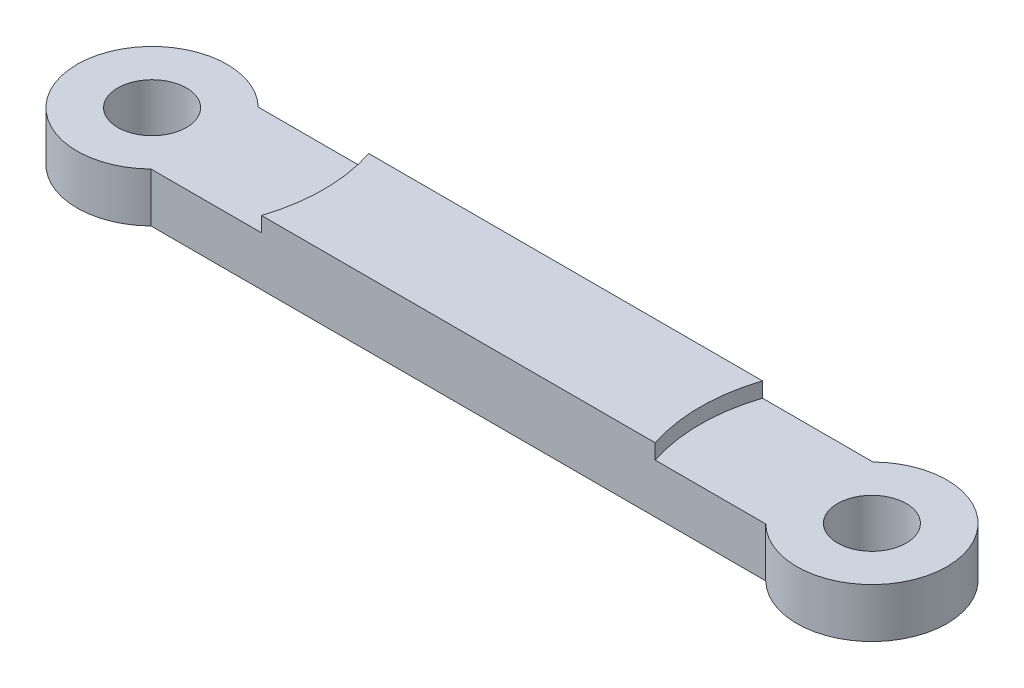
ISO-10303-21;
HEADER;
FILE_DESCRIPTION(('STEP AP214'),'2;1');
FILE_NAME('part.step','',(''),(''),'','','');
FILE_SCHEMA(('AUTOMOTIVE_DESIGN { 1 0 10303 214 1 1 1 1 }'));
ENDSEC;
DATA;
#1=APPLICATION_CONTEXT('core data for automotive mechanical design processes');
#2=APPLICATION_PROTOCOL_DEFINITION('international standard','automotive_design',2000,#1);
#3=PRODUCT_CONTEXT('',#1,'mechanical');
#4=PRODUCT('Part','Part','',(#3));
#5=PRODUCT_RELATED_PRODUCT_CATEGORY('part','',(#4));
#6=PRODUCT_DEFINITION_FORMATION('','',#4);
#7=PRODUCT_DEFINITION_CONTEXT('part definition',#1,'design');
#8=PRODUCT_DEFINITION('design','',#6,#7);
#9=PRODUCT_DEFINITION_SHAPE('','',#8);
#10=(LENGTH_UNIT() NAMED_UNIT(*) SI_UNIT(.MILLI.,.METRE.));
#11=(NAMED_UNIT(*) PLANE_ANGLE_UNIT() SI_UNIT($,.RADIAN.));
#12=(NAMED_UNIT(*) SI_UNIT($,.STERADIAN.) SOLID_ANGLE_UNIT());
#13=UNCERTAINTY_MEASURE_WITH_UNIT(LENGTH_MEASURE(1.E-05),#10,'distance_accuracy_value','');
#14=(GEOMETRIC_REPRESENTATION_CONTEXT(3) GLOBAL_UNCERTAINTY_ASSIGNED_CONTEXT((#13)) GLOBAL_UNIT_ASSIGNED_CONTEXT((#10,
#11,#12)) REPRESENTATION_CONTEXT('',''));
#15=CARTESIAN_POINT('',(0.,0.,0.));
#16=DIRECTION('',(0.,0.,1.));
#17=DIRECTION('',(1.,0.,0.));
#18=AXIS2_PLACEMENT_3D('',#15,#16,#17);
#19=CARTESIAN_POINT('',(-16.775,3.,0.));
#20=DIRECTION('',(0.,-1.,0.));
#21=DIRECTION('',(0.,0.,-1.));
#22=AXIS2_PLACEMENT_3D('',#19,#20,#21);
#23=CYLINDRICAL_SURFACE('',#22,3.5);
#24=CARTESIAN_POINT('',(-16.775,2.3,0.));
#25=DIRECTION('',(0.,1.,0.));
#26=DIRECTION('',(0.,0.,1.));
#27=AXIS2_PLACEMENT_3D('',#24,#25,#26);
#28=CIRCLE('',#27,3.5);
#29=CARTESIAN_POINT('',(-14.3255102572168,2.3,-2.5));
#30=VERTEX_POINT('',#29);
#31=CARTESIAN_POINT('',(-14.3255102572168,2.3,2.5));
#32=VERTEX_POINT('',#31);
#33=EDGE_CURVE('E165',#30,#32,#28,.T.);
#34=ORIENTED_EDGE('',*,*,#33,.F.);
#35=DIRECTION('',(0.,-1.,0.));
#36=VECTOR('',#35,1.);
#37=CARTESIAN_POINT('',(-14.3255102572168,3.,-2.5));
#38=LINE('',#37,#36);
#39=CARTESIAN_POINT('',(-14.3255102572168,0.,-2.5));
#40=VERTEX_POINT('',#39);
#41=EDGE_CURVE('E127',#30,#40,#38,.T.);
#42=ORIENTED_EDGE('',*,*,#41,.T.);
#43=CARTESIAN_POINT('',(-16.775,0.,0.));
#44=DIRECTION('',(0.,1.,0.));
#45=DIRECTION('',(0.,0.,1.));
#46=AXIS2_PLACEMENT_3D('',#43,#44,#45);
#47=CIRCLE('',#46,3.5);
#48=CARTESIAN_POINT('',(-14.3255102572168,0.,2.5));
#49=VERTEX_POINT('',#48);
#50=EDGE_CURVE('E109',#40,#49,#47,.T.);
#51=ORIENTED_EDGE('',*,*,#50,.T.);
#52=DIRECTION('',(0.,-1.,0.));
#53=VECTOR('',#52,1.);
#54=CARTESIAN_POINT('',(-14.3255102572168,3.,2.5));
#55=LINE('',#54,#53);
#56=EDGE_CURVE('E146',#32,#49,#55,.T.);
#57=ORIENTED_EDGE('',*,*,#56,.F.);
#58=EDGE_LOOP('',(#34,#42,#51,#57));
#59=FACE_BOUND('',#58,.T.);
#60=ADVANCED_FACE('F39',(#59),#23,.T.);
#61=CARTESIAN_POINT('',(16.775,3.,0.));
#62=DIRECTION('',(0.,-1.,0.));
#63=DIRECTION('',(0.,0.,-1.));
#64=AXIS2_PLACEMENT_3D('',#61,#62,#63);
#65=CYLINDRICAL_SURFACE('',#64,3.5);
#66=CARTESIAN_POINT('',(16.775,2.3,0.));
#67=DIRECTION('',(0.,1.,0.));
#68=DIRECTION('',(0.,0.,1.));
#69=AXIS2_PLACEMENT_3D('',#66,#67,#68);
#70=CIRCLE('',#69,3.5);
#71=CARTESIAN_POINT('',(14.3255102572168,2.3,2.5));
#72=VERTEX_POINT('',#71);
#73=CARTESIAN_POINT('',(14.3255102572168,2.3,-2.5));
#74=VERTEX_POINT('',#73);
#75=EDGE_CURVE('E61',#72,#74,#70,.T.);
#76=ORIENTED_EDGE('',*,*,#75,.F.);
#77=DIRECTION('',(0.,-1.,0.));
#78=VECTOR('',#77,1.);
#79=CARTESIAN_POINT('',(14.3255102572168,3.,2.5));
#80=LINE('',#79,#78);
#81=CARTESIAN_POINT('',(14.3255102572168,0.,2.5));
#82=VERTEX_POINT('',#81);
#83=EDGE_CURVE('E144',#72,#82,#80,.T.);
#84=ORIENTED_EDGE('',*,*,#83,.T.);
#85=CARTESIAN_POINT('',(16.775,0.,0.));
#86=DIRECTION('',(0.,1.,0.));
#87=DIRECTION('',(0.,0.,1.));
#88=AXIS2_PLACEMENT_3D('',#85,#86,#87);
#89=CIRCLE('',#88,3.5);
#90=CARTESIAN_POINT('',(14.3255102572168,0.,-2.5));
#91=VERTEX_POINT('',#90);
#92=EDGE_CURVE('E130',#82,#91,#89,.T.);
#93=ORIENTED_EDGE('',*,*,#92,.T.);
#94=DIRECTION('',(0.,-1.,0.));
#95=VECTOR('',#94,1.);
#96=CARTESIAN_POINT('',(14.3255102572168,3.,-2.5));
#97=LINE('',#96,#95);
#98=EDGE_CURVE('E142',#74,#91,#97,.T.);
#99=ORIENTED_EDGE('',*,*,#98,.F.);
#100=EDGE_LOOP('',(#76,#84,#93,#99));
#101=FACE_BOUND('',#100,.T.);
#102=ADVANCED_FACE('F175',(#101),#65,.T.);
#103=CARTESIAN_POINT('',(-16.775,3.,0.));
#104=DIRECTION('',(0.,1.,0.));
#105=DIRECTION('',(0.,0.,1.));
#106=AXIS2_PLACEMENT_3D('',#103,#104,#105);
#107=PLANE('',#106);
#108=CARTESIAN_POINT('',(-16.775,3.,0.));
#109=DIRECTION('',(0.,1.,0.));
#110=DIRECTION('',(0.,0.,1.));
#111=AXIS2_PLACEMENT_3D('',#108,#109,#110);
#112=CIRCLE('',#111,8.);
#113=CARTESIAN_POINT('',(-9.17565792321467,3.,2.5));
#114=VERTEX_POINT('',#113);
#115=CARTESIAN_POINT('',(-9.17565792321467,3.,-2.5));
#116=VERTEX_POINT('',#115);
#117=EDGE_CURVE('E105',#114,#116,#112,.T.);
#118=ORIENTED_EDGE('',*,*,#117,.F.);
#119=DIRECTION('',(1.,0.,0.));
#120=VECTOR('',#119,1.);
#121=CARTESIAN_POINT('',(-14.3255102572168,3.,2.5));
#122=LINE('',#121,#120);
#123=CARTESIAN_POINT('',(9.17565792321466,3.,2.5));
#124=VERTEX_POINT('',#123);
#125=EDGE_CURVE('E117',#114,#124,#122,.T.);
#126=ORIENTED_EDGE('',*,*,#125,.T.);
#127=CARTESIAN_POINT('',(16.775,3.,0.));
#128=DIRECTION('',(0.,1.,0.));
#129=DIRECTION('',(0.,0.,1.));
#130=AXIS2_PLACEMENT_3D('',#127,#128,#129);
#131=CIRCLE('',#130,8.);
#132=CARTESIAN_POINT('',(9.17565792321466,3.,-2.5));
#133=VERTEX_POINT('',#132);
#134=EDGE_CURVE('E120',#133,#124,#131,.T.);
#135=ORIENTED_EDGE('',*,*,#134,.F.);
#136=DIRECTION('',(-1.,0.,0.));
#137=VECTOR('',#136,1.);
#138=CARTESIAN_POINT('',(-14.3255102572168,3.,-2.5));
#139=LINE('',#138,#137);
#140=EDGE_CURVE('E119',#133,#116,#139,.T.);
#141=ORIENTED_EDGE('',*,*,#140,.T.);
#142=EDGE_LOOP('',(#118,#126,#135,#141));
#143=FACE_BOUND('',#142,.T.);
#144=ADVANCED_FACE('F115',(#143),#107,.T.);
#145=CARTESIAN_POINT('',(-16.775,0.,0.));
#146=DIRECTION('',(0.,1.,0.));
#147=DIRECTION('',(0.,0.,1.));
#148=AXIS2_PLACEMENT_3D('',#145,#146,#147);
#149=PLANE('',#148);
#150=CARTESIAN_POINT('',(-16.775,0.,0.));
#151=DIRECTION('',(0.,1.,0.));
#152=DIRECTION('',(0.,0.,1.));
#153=AXIS2_PLACEMENT_3D('',#150,#151,#152);
#154=CIRCLE('',#153,1.6);
#155=CARTESIAN_POINT('',(-16.775,0.,1.6));
#156=VERTEX_POINT('',#155);
#157=EDGE_CURVE('E159',#156,#156,#154,.T.);
#158=ORIENTED_EDGE('',*,*,#157,.T.);
#159=EDGE_LOOP('',(#158));
#160=FACE_BOUND('',#159,.T.);
#161=CARTESIAN_POINT('',(16.775,0.,0.));
#162=DIRECTION('',(0.,1.,0.));
#163=DIRECTION('',(0.,0.,1.));
#164=AXIS2_PLACEMENT_3D('',#161,#162,#163);
#165=CIRCLE('',#164,1.6);
#166=CARTESIAN_POINT('',(16.775,0.,1.6));
#167=VERTEX_POINT('',#166);
#168=EDGE_CURVE('E234',#167,#167,#165,.T.);
#169=ORIENTED_EDGE('',*,*,#168,.T.);
#170=EDGE_LOOP('',(#169));
#171=FACE_BOUND('',#170,.T.);
#172=ORIENTED_EDGE('',*,*,#50,.F.);
#173=DIRECTION('',(-1.,0.,0.));
#174=VECTOR('',#173,1.);
#175=CARTESIAN_POINT('',(-14.3255102572168,0.,-2.5));
#176=LINE('',#175,#174);
#177=EDGE_CURVE('E125',#91,#40,#176,.T.);
#178=ORIENTED_EDGE('',*,*,#177,.F.);
#179=ORIENTED_EDGE('',*,*,#92,.F.);
#180=DIRECTION('',(1.,0.,0.));
#181=VECTOR('',#180,1.);
#182=CARTESIAN_POINT('',(-14.3255102572168,0.,2.5));
#183=LINE('',#182,#181);
#184=EDGE_CURVE('E136',#49,#82,#183,.T.);
#185=ORIENTED_EDGE('',*,*,#184,.F.);
#186=EDGE_LOOP('',(#172,#178,#179,#185));
#187=FACE_BOUND('',#186,.T.);
#188=ADVANCED_FACE('F182',(#160,#171,#187),#149,.F.);
#189=CARTESIAN_POINT('',(-14.3255102572168,3.,2.5));
#190=DIRECTION('',(0.,0.,-1.));
#191=DIRECTION('',(-1.,0.,0.));
#192=AXIS2_PLACEMENT_3D('',#189,#190,#191);
#193=PLANE('',#192);
#194=ORIENTED_EDGE('',*,*,#125,.F.);
#195=DIRECTION('',(0.,1.,0.));
#196=VECTOR('',#195,1.);
#197=CARTESIAN_POINT('',(-9.17565792321467,2.3,2.5));
#198=LINE('',#197,#196);
#199=CARTESIAN_POINT('',(-9.17565792321467,2.3,2.5));
#200=VERTEX_POINT('',#199);
#201=EDGE_CURVE('E102',#114,#200,#198,.F.);
#202=ORIENTED_EDGE('',*,*,#201,.T.);
#203=DIRECTION('',(1.,0.,0.));
#204=VECTOR('',#203,1.);
#205=CARTESIAN_POINT('',(-14.3255102572168,2.3,2.5));
#206=LINE('',#205,#204);
#207=EDGE_CURVE('E167',#32,#200,#206,.T.);
#208=ORIENTED_EDGE('',*,*,#207,.F.);
#209=ORIENTED_EDGE('',*,*,#56,.T.);
#210=ORIENTED_EDGE('',*,*,#184,.T.);
#211=ORIENTED_EDGE('',*,*,#83,.F.);
#212=DIRECTION('',(1.,0.,0.));
#213=VECTOR('',#212,1.);
#214=CARTESIAN_POINT('',(-14.3255102572168,2.3,2.5));
#215=LINE('',#214,#213);
#216=CARTESIAN_POINT('',(9.17565792321466,2.3,2.5));
#217=VERTEX_POINT('',#216);
#218=EDGE_CURVE('E171',#217,#72,#215,.T.);
#219=ORIENTED_EDGE('',*,*,#218,.F.);
#220=DIRECTION('',(0.,1.,0.));
#221=VECTOR('',#220,1.);
#222=CARTESIAN_POINT('',(9.17565792321466,2.3,2.5));
#223=LINE('',#222,#221);
#224=EDGE_CURVE('E110',#217,#124,#223,.T.);
#225=ORIENTED_EDGE('',*,*,#224,.T.);
#226=EDGE_LOOP('',(#194,#202,#208,#209,#210,#211,#219,#225));
#227=FACE_BOUND('',#226,.T.);
#228=ADVANCED_FACE('F123',(#227),#193,.F.);
#229=CARTESIAN_POINT('',(-14.3255102572168,3.,-2.5));
#230=DIRECTION('',(0.,0.,1.));
#231=DIRECTION('',(1.,0.,0.));
#232=AXIS2_PLACEMENT_3D('',#229,#230,#231);
#233=PLANE('',#232);
#234=DIRECTION('',(-1.,0.,0.));
#235=VECTOR('',#234,1.);
#236=CARTESIAN_POINT('',(-14.3255102572168,2.3,-2.5));
#237=LINE('',#236,#235);
#238=CARTESIAN_POINT('',(-9.17565792321467,2.3,-2.5));
#239=VERTEX_POINT('',#238);
#240=EDGE_CURVE('E163',#239,#30,#237,.T.);
#241=ORIENTED_EDGE('',*,*,#240,.F.);
#242=DIRECTION('',(0.,1.,0.));
#243=VECTOR('',#242,1.);
#244=CARTESIAN_POINT('',(-9.17565792321467,2.3,-2.5));
#245=LINE('',#244,#243);
#246=EDGE_CURVE('E11',#239,#116,#245,.T.);
#247=ORIENTED_EDGE('',*,*,#246,.T.);
#248=ORIENTED_EDGE('',*,*,#140,.F.);
#249=DIRECTION('',(0.,1.,0.));
#250=VECTOR('',#249,1.);
#251=CARTESIAN_POINT('',(9.17565792321466,2.3,-2.5));
#252=LINE('',#251,#250);
#253=CARTESIAN_POINT('',(9.17565792321466,2.3,-2.5));
#254=VERTEX_POINT('',#253);
#255=EDGE_CURVE('E46',#133,#254,#252,.F.);
#256=ORIENTED_EDGE('',*,*,#255,.T.);
#257=DIRECTION('',(-1.,0.,0.));
#258=VECTOR('',#257,1.);
#259=CARTESIAN_POINT('',(-14.3255102572168,2.3,-2.5));
#260=LINE('',#259,#258);
#261=EDGE_CURVE('E151',#74,#254,#260,.T.);
#262=ORIENTED_EDGE('',*,*,#261,.F.);
#263=ORIENTED_EDGE('',*,*,#98,.T.);
#264=ORIENTED_EDGE('',*,*,#177,.T.);
#265=ORIENTED_EDGE('',*,*,#41,.F.);
#266=EDGE_LOOP('',(#241,#247,#248,#256,#262,#263,#264,#265));
#267=FACE_BOUND('',#266,.T.);
#268=ADVANCED_FACE('F150',(#267),#233,.F.);
#269=CARTESIAN_POINT('',(-16.775,2.3,0.));
#270=DIRECTION('',(0.,1.,0.));
#271=DIRECTION('',(0.,0.,1.));
#272=AXIS2_PLACEMENT_3D('',#269,#270,#271);
#273=CYLINDRICAL_SURFACE('',#272,8.);
#274=ORIENTED_EDGE('',*,*,#117,.T.);
#275=ORIENTED_EDGE('',*,*,#246,.F.);
#276=CARTESIAN_POINT('',(-16.775,2.3,0.));
#277=DIRECTION('',(0.,1.,0.));
#278=DIRECTION('',(0.,0.,1.));
#279=AXIS2_PLACEMENT_3D('',#276,#277,#278);
#280=CIRCLE('',#279,8.);
#281=EDGE_CURVE('E53',#200,#239,#280,.T.);
#282=ORIENTED_EDGE('',*,*,#281,.F.);
#283=ORIENTED_EDGE('',*,*,#201,.F.);
#284=EDGE_LOOP('',(#274,#275,#282,#283));
#285=FACE_BOUND('',#284,.T.);
#286=ADVANCED_FACE('F104',(#285),#273,.F.);
#287=CARTESIAN_POINT('',(-16.775,2.3,0.));
#288=DIRECTION('',(0.,1.,0.));
#289=DIRECTION('',(0.,0.,1.));
#290=AXIS2_PLACEMENT_3D('',#287,#288,#289);
#291=PLANE('',#290);
#292=CARTESIAN_POINT('',(-16.775,2.3,0.));
#293=DIRECTION('',(0.,1.,0.));
#294=DIRECTION('',(0.,0.,1.));
#295=AXIS2_PLACEMENT_3D('',#292,#293,#294);
#296=CIRCLE('',#295,1.6);
#297=CARTESIAN_POINT('',(-16.775,2.3,1.6));
#298=VERTEX_POINT('',#297);
#299=EDGE_CURVE('E231',#298,#298,#296,.T.);
#300=ORIENTED_EDGE('',*,*,#299,.F.);
#301=EDGE_LOOP('',(#300));
#302=FACE_BOUND('',#301,.T.);
#303=ORIENTED_EDGE('',*,*,#207,.T.);
#304=ORIENTED_EDGE('',*,*,#281,.T.);
#305=ORIENTED_EDGE('',*,*,#240,.T.);
#306=ORIENTED_EDGE('',*,*,#33,.T.);
#307=EDGE_LOOP('',(#303,#304,#305,#306));
#308=FACE_BOUND('',#307,.T.);
#309=ADVANCED_FACE('F186',(#302,#308),#291,.T.);
#310=CARTESIAN_POINT('',(16.775,2.3,0.));
#311=DIRECTION('',(0.,1.,0.));
#312=DIRECTION('',(0.,0.,1.));
#313=AXIS2_PLACEMENT_3D('',#310,#311,#312);
#314=CYLINDRICAL_SURFACE('',#313,8.);
#315=CARTESIAN_POINT('',(16.775,2.3,0.));
#316=DIRECTION('',(0.,1.,0.));
#317=DIRECTION('',(0.,0.,1.));
#318=AXIS2_PLACEMENT_3D('',#315,#316,#317);
#319=CIRCLE('',#318,8.);
#320=EDGE_CURVE('E157',#254,#217,#319,.T.);
#321=ORIENTED_EDGE('',*,*,#320,.F.);
#322=ORIENTED_EDGE('',*,*,#255,.F.);
#323=ORIENTED_EDGE('',*,*,#134,.T.);
#324=ORIENTED_EDGE('',*,*,#224,.F.);
#325=EDGE_LOOP('',(#321,#322,#323,#324));
#326=FACE_BOUND('',#325,.T.);
#327=ADVANCED_FACE('F155',(#326),#314,.F.);
#328=CARTESIAN_POINT('',(16.775,2.3,0.));
#329=DIRECTION('',(0.,1.,0.));
#330=DIRECTION('',(0.,0.,1.));
#331=AXIS2_PLACEMENT_3D('',#328,#329,#330);
#332=PLANE('',#331);
#333=CARTESIAN_POINT('',(16.775,2.3,0.));
#334=DIRECTION('',(0.,1.,0.));
#335=DIRECTION('',(0.,0.,1.));
#336=AXIS2_PLACEMENT_3D('',#333,#334,#335);
#337=CIRCLE('',#336,1.6);
#338=CARTESIAN_POINT('',(16.775,2.3,1.6));
#339=VERTEX_POINT('',#338);
#340=EDGE_CURVE('E230',#339,#339,#337,.T.);
#341=ORIENTED_EDGE('',*,*,#340,.F.);
#342=EDGE_LOOP('',(#341));
#343=FACE_BOUND('',#342,.T.);
#344=ORIENTED_EDGE('',*,*,#218,.T.);
#345=ORIENTED_EDGE('',*,*,#75,.T.);
#346=ORIENTED_EDGE('',*,*,#261,.T.);
#347=ORIENTED_EDGE('',*,*,#320,.T.);
#348=EDGE_LOOP('',(#344,#345,#346,#347));
#349=FACE_BOUND('',#348,.T.);
#350=ADVANCED_FACE('F172',(#343,#349),#332,.T.);
#351=CARTESIAN_POINT('',(16.775,-8.2,0.));
#352=DIRECTION('',(0.,1.,0.));
#353=DIRECTION('',(0.,0.,1.));
#354=AXIS2_PLACEMENT_3D('',#351,#352,#353);
#355=CYLINDRICAL_SURFACE('',#354,1.6);
#356=CARTESIAN_POINT('',(16.775,2.3,1.6));
#357=CARTESIAN_POINT('',(16.775,2.27604166666667,1.6));
#358=CARTESIAN_POINT('',(16.775,2.25208333333333,1.6));
#359=CARTESIAN_POINT('',(16.775,2.20416666666667,1.6));
#360=CARTESIAN_POINT('',(16.775,2.18020833333333,1.6));
#361=CARTESIAN_POINT('',(16.775,2.13229166666667,1.6));
#362=CARTESIAN_POINT('',(16.775,2.10833333333333,1.6));
#363=CARTESIAN_POINT('',(16.775,2.06041666666667,1.6));
#364=CARTESIAN_POINT('',(16.775,2.03645833333333,1.6));
#365=CARTESIAN_POINT('',(16.775,1.98854166666667,1.6));
#366=CARTESIAN_POINT('',(16.775,1.96458333333333,1.6));
#367=CARTESIAN_POINT('',(16.775,1.91666666666667,1.6));
#368=CARTESIAN_POINT('',(16.775,1.89270833333333,1.6));
#369=CARTESIAN_POINT('',(16.775,1.84479166666667,1.6));
#370=CARTESIAN_POINT('',(16.775,1.82083333333333,1.6));
#371=CARTESIAN_POINT('',(16.775,1.77291666666667,1.6));
#372=CARTESIAN_POINT('',(16.775,1.74895833333333,1.6));
#373=CARTESIAN_POINT('',(16.775,1.70104166666667,1.6));
#374=CARTESIAN_POINT('',(16.775,1.67708333333333,1.6));
#375=CARTESIAN_POINT('',(16.775,1.62916666666667,1.6));
#376=CARTESIAN_POINT('',(16.775,1.60520833333333,1.6));
#377=CARTESIAN_POINT('',(16.775,1.55729166666667,1.6));
#378=CARTESIAN_POINT('',(16.775,1.53333333333333,1.6));
#379=CARTESIAN_POINT('',(16.775,1.48541666666667,1.6));
#380=CARTESIAN_POINT('',(16.775,1.46145833333333,1.6));
#381=CARTESIAN_POINT('',(16.775,1.41354166666667,1.6));
#382=CARTESIAN_POINT('',(16.775,1.38958333333333,1.6));
#383=CARTESIAN_POINT('',(16.775,1.34166666666667,1.6));
#384=CARTESIAN_POINT('',(16.775,1.31770833333333,1.6));
#385=CARTESIAN_POINT('',(16.775,1.26979166666667,1.6));
#386=CARTESIAN_POINT('',(16.775,1.24583333333333,1.6));
#387=CARTESIAN_POINT('',(16.775,1.19791666666667,1.6));
#388=CARTESIAN_POINT('',(16.775,1.17395833333333,1.6));
#389=CARTESIAN_POINT('',(16.775,1.12604166666667,1.6));
#390=CARTESIAN_POINT('',(16.775,1.10208333333333,1.6));
#391=CARTESIAN_POINT('',(16.775,1.05416666666667,1.6));
#392=CARTESIAN_POINT('',(16.775,1.03020833333333,1.6));
#393=CARTESIAN_POINT('',(16.775,0.982291666666667,1.6));
#394=CARTESIAN_POINT('',(16.775,0.958333333333333,1.6));
#395=CARTESIAN_POINT('',(16.775,0.910416666666666,1.6));
#396=CARTESIAN_POINT('',(16.775,0.886458333333333,1.6));
#397=CARTESIAN_POINT('',(16.775,0.838541666666667,1.6));
#398=CARTESIAN_POINT('',(16.775,0.814583333333333,1.6));
#399=CARTESIAN_POINT('',(16.775,0.766666666666667,1.6));
#400=CARTESIAN_POINT('',(16.775,0.742708333333334,1.6));
#401=CARTESIAN_POINT('',(16.775,0.694791666666667,1.6));
#402=CARTESIAN_POINT('',(16.775,0.670833333333334,1.6));
#403=CARTESIAN_POINT('',(16.775,0.622916666666666,1.6));
#404=CARTESIAN_POINT('',(16.775,0.598958333333333,1.6));
#405=CARTESIAN_POINT('',(16.775,0.551041666666666,1.6));
#406=CARTESIAN_POINT('',(16.775,0.527083333333333,1.6));
#407=CARTESIAN_POINT('',(16.775,0.479166666666667,1.6));
#408=CARTESIAN_POINT('',(16.775,0.455208333333333,1.6));
#409=CARTESIAN_POINT('',(16.775,0.407291666666666,1.6));
#410=CARTESIAN_POINT('',(16.775,0.383333333333333,1.6));
#411=CARTESIAN_POINT('',(16.775,0.335416666666667,1.6));
#412=CARTESIAN_POINT('',(16.775,0.311458333333333,1.6));
#413=CARTESIAN_POINT('',(16.775,0.263541666666667,1.6));
#414=CARTESIAN_POINT('',(16.775,0.239583333333334,1.6));
#415=CARTESIAN_POINT('',(16.775,0.191666666666667,1.6));
#416=CARTESIAN_POINT('',(16.775,0.167708333333333,1.6));
#417=CARTESIAN_POINT('',(16.775,0.119791666666666,1.6));
#418=CARTESIAN_POINT('',(16.775,0.0958333333333326,1.6));
#419=CARTESIAN_POINT('',(16.775,0.047916666666666,1.6));
#420=CARTESIAN_POINT('',(16.775,0.023958333333333,1.6));
#421=CARTESIAN_POINT('',(16.775,0.,1.6));
#422=B_SPLINE_CURVE_WITH_KNOTS('',3,(#356,#357,#358,#359,#360,#361,#362,#363,#364,#365,#366,
#367,#368,#369,#370,#371,#372,#373,#374,#375,#376,#377,#378,#379,#380,#381,#382,#383,#384,#385,
#386,#387,#388,#389,#390,#391,#392,#393,#394,#395,#396,#397,#398,#399,#400,#401,#402,#403,#404,
#405,#406,#407,#408,#409,#410,#411,#412,#413,#414,#415,#416,#417,#418,#419,#420,#421),
.UNSPECIFIED.,.F.,.F.,(4,2,2,2,2,2,2,2,2,2,2,2,2,2,2,2,2,2,2,2,2,2,2,2,2,2,2,2,2,2,2,2,4),(0.,
0.0718750000000008,0.14375,0.215625000000001,0.2875,0.359375,0.431249999999999,0.503125,
0.574999999999999,0.646875,0.718750000000001,0.790625,0.8625,0.934374999999999,1.00625,1.078125,
1.15,1.221875,1.29375,1.365625,1.4375,1.509375,1.58125,1.653125,1.725,1.796875,1.86875,1.940625,
2.0125,2.084375,2.15625,2.228125,2.3),.UNSPECIFIED.);
#423=EDGE_CURVE('BSEAM221',#339,#167,#422,.T.);
#424=ORIENTED_EDGE('',*,*,#340,.T.);
#425=ORIENTED_EDGE('',*,*,#168,.F.);
#426=ORIENTED_EDGE('',*,*,#423,.T.);
#427=ORIENTED_EDGE('',*,*,#423,.F.);
#428=EDGE_LOOP('',(#424,#426,#425,#427));
#429=FACE_BOUND('',#428,.T.);
#430=ADVANCED_FACE('F221',(#429),#355,.F.);
#431=CARTESIAN_POINT('',(-16.775,-8.2,0.));
#432=DIRECTION('',(0.,1.,0.));
#433=DIRECTION('',(0.,0.,1.));
#434=AXIS2_PLACEMENT_3D('',#431,#432,#433);
#435=CYLINDRICAL_SURFACE('',#434,1.6);
#436=CARTESIAN_POINT('',(-16.775,2.3,1.6));
#437=CARTESIAN_POINT('',(-16.775,2.27604166666667,1.6));
#438=CARTESIAN_POINT('',(-16.775,2.25208333333333,1.6));
#439=CARTESIAN_POINT('',(-16.775,2.20416666666667,1.6));
#440=CARTESIAN_POINT('',(-16.775,2.18020833333333,1.6));
#441=CARTESIAN_POINT('',(-16.775,2.13229166666667,1.6));
#442=CARTESIAN_POINT('',(-16.775,2.10833333333333,1.6));
#443=CARTESIAN_POINT('',(-16.775,2.06041666666667,1.6));
#444=CARTESIAN_POINT('',(-16.775,2.03645833333333,1.6));
#445=CARTESIAN_POINT('',(-16.775,1.98854166666667,1.6));
#446=CARTESIAN_POINT('',(-16.775,1.96458333333333,1.6));
#447=CARTESIAN_POINT('',(-16.775,1.91666666666667,1.6));
#448=CARTESIAN_POINT('',(-16.775,1.89270833333333,1.6));
#449=CARTESIAN_POINT('',(-16.775,1.84479166666667,1.6));
#450=CARTESIAN_POINT('',(-16.775,1.82083333333333,1.6));
#451=CARTESIAN_POINT('',(-16.775,1.77291666666667,1.6));
#452=CARTESIAN_POINT('',(-16.775,1.74895833333333,1.6));
#453=CARTESIAN_POINT('',(-16.775,1.70104166666667,1.6));
#454=CARTESIAN_POINT('',(-16.775,1.67708333333333,1.6));
#455=CARTESIAN_POINT('',(-16.775,1.62916666666667,1.6));
#456=CARTESIAN_POINT('',(-16.775,1.60520833333333,1.6));
#457=CARTESIAN_POINT('',(-16.775,1.55729166666667,1.6));
#458=CARTESIAN_POINT('',(-16.775,1.53333333333333,1.6));
#459=CARTESIAN_POINT('',(-16.775,1.48541666666667,1.6));
#460=CARTESIAN_POINT('',(-16.775,1.46145833333333,1.6));
#461=CARTESIAN_POINT('',(-16.775,1.41354166666667,1.6));
#462=CARTESIAN_POINT('',(-16.775,1.38958333333333,1.6));
#463=CARTESIAN_POINT('',(-16.775,1.34166666666667,1.6));
#464=CARTESIAN_POINT('',(-16.775,1.31770833333333,1.6));
#465=CARTESIAN_POINT('',(-16.775,1.26979166666667,1.6));
#466=CARTESIAN_POINT('',(-16.775,1.24583333333333,1.6));
#467=CARTESIAN_POINT('',(-16.775,1.19791666666667,1.6));
#468=CARTESIAN_POINT('',(-16.775,1.17395833333333,1.6));
#469=CARTESIAN_POINT('',(-16.775,1.12604166666667,1.6));
#470=CARTESIAN_POINT('',(-16.775,1.10208333333333,1.6));
#471=CARTESIAN_POINT('',(-16.775,1.05416666666667,1.6));
#472=CARTESIAN_POINT('',(-16.775,1.03020833333333,1.6));
#473=CARTESIAN_POINT('',(-16.775,0.982291666666667,1.6));
#474=CARTESIAN_POINT('',(-16.775,0.958333333333333,1.6));
#475=CARTESIAN_POINT('',(-16.775,0.910416666666666,1.6));
#476=CARTESIAN_POINT('',(-16.775,0.886458333333333,1.6));
#477=CARTESIAN_POINT('',(-16.775,0.838541666666667,1.6));
#478=CARTESIAN_POINT('',(-16.775,0.814583333333333,1.6));
#479=CARTESIAN_POINT('',(-16.775,0.766666666666667,1.6));
#480=CARTESIAN_POINT('',(-16.775,0.742708333333334,1.6));
#481=CARTESIAN_POINT('',(-16.775,0.694791666666667,1.6));
#482=CARTESIAN_POINT('',(-16.775,0.670833333333334,1.6));
#483=CARTESIAN_POINT('',(-16.775,0.622916666666666,1.6));
#484=CARTESIAN_POINT('',(-16.775,0.598958333333333,1.6));
#485=CARTESIAN_POINT('',(-16.775,0.551041666666666,1.6));
#486=CARTESIAN_POINT('',(-16.775,0.527083333333333,1.6));
#487=CARTESIAN_POINT('',(-16.775,0.479166666666667,1.6));
#488=CARTESIAN_POINT('',(-16.775,0.455208333333333,1.6));
#489=CARTESIAN_POINT('',(-16.775,0.407291666666666,1.6));
#490=CARTESIAN_POINT('',(-16.775,0.383333333333333,1.6));
#491=CARTESIAN_POINT('',(-16.775,0.335416666666667,1.6));
#492=CARTESIAN_POINT('',(-16.775,0.311458333333333,1.6));
#493=CARTESIAN_POINT('',(-16.775,0.263541666666667,1.6));
#494=CARTESIAN_POINT('',(-16.775,0.239583333333334,1.6));
#495=CARTESIAN_POINT('',(-16.775,0.191666666666667,1.6));
#496=CARTESIAN_POINT('',(-16.775,0.167708333333333,1.6));
#497=CARTESIAN_POINT('',(-16.775,0.119791666666666,1.6));
#498=CARTESIAN_POINT('',(-16.775,0.0958333333333326,1.6));
#499=CARTESIAN_POINT('',(-16.775,0.047916666666666,1.6));
#500=CARTESIAN_POINT('',(-16.775,0.023958333333333,1.6));
#501=CARTESIAN_POINT('',(-16.775,0.,1.6));
#502=B_SPLINE_CURVE_WITH_KNOTS('',3,(#436,#437,#438,#439,#440,#441,#442,#443,#444,#445,#446,
#447,#448,#449,#450,#451,#452,#453,#454,#455,#456,#457,#458,#459,#460,#461,#462,#463,#464,#465,
#466,#467,#468,#469,#470,#471,#472,#473,#474,#475,#476,#477,#478,#479,#480,#481,#482,#483,#484,
#485,#486,#487,#488,#489,#490,#491,#492,#493,#494,#495,#496,#497,#498,#499,#500,#501),
.UNSPECIFIED.,.F.,.F.,(4,2,2,2,2,2,2,2,2,2,2,2,2,2,2,2,2,2,2,2,2,2,2,2,2,2,2,2,2,2,2,2,4),(0.,
0.0718750000000008,0.14375,0.215625000000001,0.2875,0.359375,0.431249999999999,0.503125,
0.574999999999999,0.646875,0.718750000000001,0.790625,0.8625,0.934374999999999,1.00625,1.078125,
1.15,1.221875,1.29375,1.365625,1.4375,1.509375,1.58125,1.653125,1.725,1.796875,1.86875,1.940625,
2.0125,2.084375,2.15625,2.228125,2.3),.UNSPECIFIED.);
#503=EDGE_CURVE('BSEAM226',#298,#156,#502,.T.);
#504=ORIENTED_EDGE('',*,*,#299,.T.);
#505=ORIENTED_EDGE('',*,*,#157,.F.);
#506=ORIENTED_EDGE('',*,*,#503,.T.);
#507=ORIENTED_EDGE('',*,*,#503,.F.);
#508=EDGE_LOOP('',(#504,#506,#505,#507));
#509=FACE_BOUND('',#508,.T.);
#510=ADVANCED_FACE('F226',(#509),#435,.F.);
#511=CLOSED_SHELL('',(#60,#102,#144,#188,#228,#268,#286,#309,#327,#350,#430,#510));
#512=MANIFOLD_SOLID_BREP('B2',#511);
#513=ADVANCED_BREP_SHAPE_REPRESENTATION('',(#18,#512),#14);
#514=SHAPE_DEFINITION_REPRESENTATION(#9,#513);
ENDSEC;
END-ISO-10303-21;
